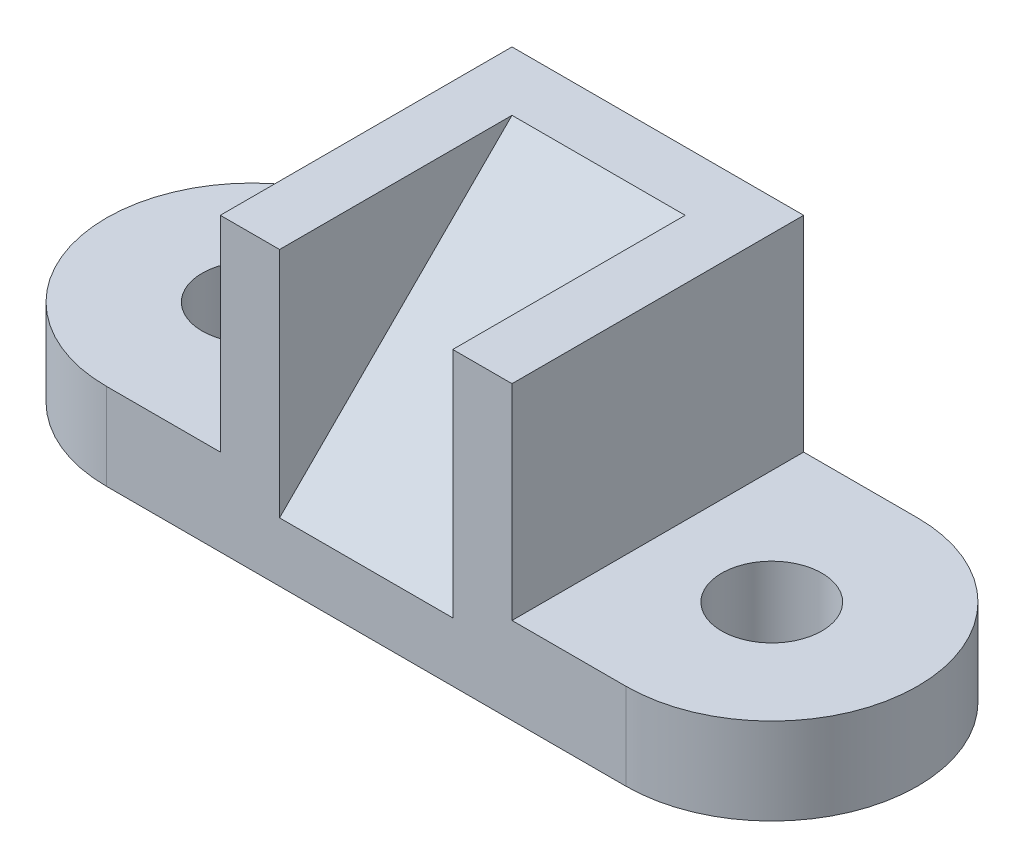
ISO-10303-21;
HEADER;
FILE_DESCRIPTION(('STEP AP214'),'2;1');
FILE_NAME('part.step','',(''),(''),'','','');
FILE_SCHEMA(('AUTOMOTIVE_DESIGN { 1 0 10303 214 1 1 1 1 }'));
ENDSEC;
DATA;
#1=APPLICATION_CONTEXT('core data for automotive mechanical design processes');
#2=APPLICATION_PROTOCOL_DEFINITION('international standard','automotive_design',2000,#1);
#3=PRODUCT_CONTEXT('',#1,'mechanical');
#4=PRODUCT('Part','Part','',(#3));
#5=PRODUCT_RELATED_PRODUCT_CATEGORY('part','',(#4));
#6=PRODUCT_DEFINITION_FORMATION('','',#4);
#7=PRODUCT_DEFINITION_CONTEXT('part definition',#1,'design');
#8=PRODUCT_DEFINITION('design','',#6,#7);
#9=PRODUCT_DEFINITION_SHAPE('','',#8);
#10=(LENGTH_UNIT() NAMED_UNIT(*) SI_UNIT(.MILLI.,.METRE.));
#11=(NAMED_UNIT(*) PLANE_ANGLE_UNIT() SI_UNIT($,.RADIAN.));
#12=(NAMED_UNIT(*) SI_UNIT($,.STERADIAN.) SOLID_ANGLE_UNIT());
#13=UNCERTAINTY_MEASURE_WITH_UNIT(LENGTH_MEASURE(1.E-05),#10,'distance_accuracy_value','');
#14=(GEOMETRIC_REPRESENTATION_CONTEXT(3) GLOBAL_UNCERTAINTY_ASSIGNED_CONTEXT((#13)) GLOBAL_UNIT_ASSIGNED_CONTEXT((#10,
#11,#12)) REPRESENTATION_CONTEXT('',''));
#15=CARTESIAN_POINT('',(0.,0.,0.));
#16=DIRECTION('',(0.,0.,1.));
#17=DIRECTION('',(1.,0.,0.));
#18=AXIS2_PLACEMENT_3D('',#15,#16,#17);
#19=CARTESIAN_POINT('',(0.,19.,0.));
#20=DIRECTION('',(0.,1.,0.));
#21=DIRECTION('',(0.,0.,1.));
#22=AXIS2_PLACEMENT_3D('',#19,#20,#21);
#23=PLANE('',#22);
#24=DIRECTION('',(0.,0.,1.));
#25=VECTOR('',#24,1.);
#26=CARTESIAN_POINT('',(25.,19.,-32.));
#27=LINE('',#26,#25);
#28=CARTESIAN_POINT('',(25.,19.,-32.));
#29=VERTEX_POINT('',#28);
#30=CARTESIAN_POINT('',(25.,19.,32.));
#31=VERTEX_POINT('',#30);
#32=EDGE_CURVE('E58',#29,#31,#27,.T.);
#33=ORIENTED_EDGE('',*,*,#32,.F.);
#34=DIRECTION('',(-1.,0.,0.));
#35=VECTOR('',#34,1.);
#36=CARTESIAN_POINT('',(0.,19.,-32.));
#37=LINE('',#36,#35);
#38=CARTESIAN_POINT('',(0.,19.,-32.));
#39=VERTEX_POINT('',#38);
#40=EDGE_CURVE('E234',#29,#39,#37,.T.);
#41=ORIENTED_EDGE('',*,*,#40,.T.);
#42=CARTESIAN_POINT('',(0.,19.,0.));
#43=DIRECTION('',(0.,1.,0.));
#44=DIRECTION('',(0.,0.,1.));
#45=AXIS2_PLACEMENT_3D('',#42,#43,#44);
#46=CIRCLE('',#45,32.);
#47=CARTESIAN_POINT('',(0.,19.,32.));
#48=VERTEX_POINT('',#47);
#49=EDGE_CURVE('E202',#39,#48,#46,.T.);
#50=ORIENTED_EDGE('',*,*,#49,.T.);
#51=DIRECTION('',(1.,0.,0.));
#52=VECTOR('',#51,1.);
#53=CARTESIAN_POINT('',(0.,19.,32.));
#54=LINE('',#53,#52);
#55=EDGE_CURVE('E215',#48,#31,#54,.T.);
#56=ORIENTED_EDGE('',*,*,#55,.T.);
#57=EDGE_LOOP('',(#33,#41,#50,#56));
#58=FACE_BOUND('',#57,.T.);
#59=CARTESIAN_POINT('',(0.,19.,0.));
#60=DIRECTION('',(0.,1.,0.));
#61=DIRECTION('',(0.,0.,1.));
#62=AXIS2_PLACEMENT_3D('',#59,#60,#61);
#63=CIRCLE('',#62,11.);
#64=CARTESIAN_POINT('',(0.,19.,11.));
#65=VERTEX_POINT('',#64);
#66=EDGE_CURVE('E196',#65,#65,#63,.T.);
#67=ORIENTED_EDGE('',*,*,#66,.F.);
#68=EDGE_LOOP('',(#67));
#69=FACE_BOUND('',#68,.T.);
#70=ADVANCED_FACE('F33',(#58,#69),#23,.T.);
#71=DIRECTION('',(0.,0.,-1.));
#72=VECTOR('',#71,1.);
#73=CARTESIAN_POINT('',(89.,19.,-32.));
#74=LINE('',#73,#72);
#75=CARTESIAN_POINT('',(89.,19.,32.));
#76=VERTEX_POINT('',#75);
#77=CARTESIAN_POINT('',(89.,19.,-32.));
#78=VERTEX_POINT('',#77);
#79=EDGE_CURVE('E148',#76,#78,#74,.T.);
#80=ORIENTED_EDGE('',*,*,#79,.F.);
#81=CARTESIAN_POINT('',(114.,19.,32.));
#82=VERTEX_POINT('',#81);
#83=EDGE_CURVE('E205',#76,#82,#54,.T.);
#84=ORIENTED_EDGE('',*,*,#83,.T.);
#85=CARTESIAN_POINT('',(114.,19.,0.));
#86=DIRECTION('',(0.,1.,0.));
#87=DIRECTION('',(0.,0.,1.));
#88=AXIS2_PLACEMENT_3D('',#85,#86,#87);
#89=CIRCLE('',#88,32.);
#90=CARTESIAN_POINT('',(114.,19.,-32.));
#91=VERTEX_POINT('',#90);
#92=EDGE_CURVE('E209',#82,#91,#89,.T.);
#93=ORIENTED_EDGE('',*,*,#92,.T.);
#94=EDGE_CURVE('E225',#91,#78,#37,.T.);
#95=ORIENTED_EDGE('',*,*,#94,.T.);
#96=EDGE_LOOP('',(#80,#84,#93,#95));
#97=FACE_BOUND('',#96,.T.);
#98=CARTESIAN_POINT('',(114.,19.,0.));
#99=DIRECTION('',(0.,1.,0.));
#100=DIRECTION('',(0.,0.,1.));
#101=AXIS2_PLACEMENT_3D('',#98,#99,#100);
#102=CIRCLE('',#101,11.);
#103=CARTESIAN_POINT('',(114.,19.,11.));
#104=VERTEX_POINT('',#103);
#105=EDGE_CURVE('E189',#104,#104,#102,.T.);
#106=ORIENTED_EDGE('',*,*,#105,.F.);
#107=EDGE_LOOP('',(#106));
#108=FACE_BOUND('',#107,.T.);
#109=ADVANCED_FACE('F240',(#97,#108),#23,.T.);
#110=CARTESIAN_POINT('',(0.,0.,0.));
#111=DIRECTION('',(0.,1.,0.));
#112=DIRECTION('',(0.,0.,1.));
#113=AXIS2_PLACEMENT_3D('',#110,#111,#112);
#114=PLANE('',#113);
#115=CARTESIAN_POINT('',(0.,0.,0.));
#116=DIRECTION('',(0.,1.,0.));
#117=DIRECTION('',(0.,0.,1.));
#118=AXIS2_PLACEMENT_3D('',#115,#116,#117);
#119=CIRCLE('',#118,11.);
#120=CARTESIAN_POINT('',(0.,0.,11.));
#121=VERTEX_POINT('',#120);
#122=EDGE_CURVE('E194',#121,#121,#119,.T.);
#123=ORIENTED_EDGE('',*,*,#122,.T.);
#124=EDGE_LOOP('',(#123));
#125=FACE_BOUND('',#124,.T.);
#126=CARTESIAN_POINT('',(0.,0.,0.));
#127=DIRECTION('',(0.,1.,0.));
#128=DIRECTION('',(0.,0.,1.));
#129=AXIS2_PLACEMENT_3D('',#126,#127,#128);
#130=CIRCLE('',#129,32.);
#131=CARTESIAN_POINT('',(0.,0.,-32.));
#132=VERTEX_POINT('',#131);
#133=CARTESIAN_POINT('',(0.,0.,32.));
#134=VERTEX_POINT('',#133);
#135=EDGE_CURVE('E199',#132,#134,#130,.T.);
#136=ORIENTED_EDGE('',*,*,#135,.F.);
#137=DIRECTION('',(-1.,0.,0.));
#138=VECTOR('',#137,1.);
#139=CARTESIAN_POINT('',(0.,0.,-32.));
#140=LINE('',#139,#138);
#141=CARTESIAN_POINT('',(114.,0.,-32.));
#142=VERTEX_POINT('',#141);
#143=EDGE_CURVE('E206',#142,#132,#140,.T.);
#144=ORIENTED_EDGE('',*,*,#143,.F.);
#145=CARTESIAN_POINT('',(114.,0.,0.));
#146=DIRECTION('',(0.,1.,0.));
#147=DIRECTION('',(0.,0.,1.));
#148=AXIS2_PLACEMENT_3D('',#145,#146,#147);
#149=CIRCLE('',#148,32.);
#150=CARTESIAN_POINT('',(114.,0.,32.));
#151=VERTEX_POINT('',#150);
#152=EDGE_CURVE('E227',#151,#142,#149,.T.);
#153=ORIENTED_EDGE('',*,*,#152,.F.);
#154=DIRECTION('',(1.,0.,0.));
#155=VECTOR('',#154,1.);
#156=CARTESIAN_POINT('',(0.,0.,32.));
#157=LINE('',#156,#155);
#158=EDGE_CURVE('E229',#134,#151,#157,.T.);
#159=ORIENTED_EDGE('',*,*,#158,.F.);
#160=EDGE_LOOP('',(#136,#144,#153,#159));
#161=FACE_BOUND('',#160,.T.);
#162=CARTESIAN_POINT('',(114.,0.,0.));
#163=DIRECTION('',(0.,1.,0.));
#164=DIRECTION('',(0.,0.,1.));
#165=AXIS2_PLACEMENT_3D('',#162,#163,#164);
#166=CIRCLE('',#165,11.);
#167=CARTESIAN_POINT('',(114.,0.,11.));
#168=VERTEX_POINT('',#167);
#169=EDGE_CURVE('E186',#168,#168,#166,.T.);
#170=ORIENTED_EDGE('',*,*,#169,.T.);
#171=EDGE_LOOP('',(#170));
#172=FACE_BOUND('',#171,.T.);
#173=ADVANCED_FACE('F266',(#125,#161,#172),#114,.F.);
#174=CARTESIAN_POINT('',(0.,19.,0.));
#175=DIRECTION('',(0.,-1.,0.));
#176=DIRECTION('',(0.,0.,-1.));
#177=AXIS2_PLACEMENT_3D('',#174,#175,#176);
#178=CYLINDRICAL_SURFACE('',#177,32.);
#179=ORIENTED_EDGE('',*,*,#135,.T.);
#180=DIRECTION('',(0.,-1.,0.));
#181=VECTOR('',#180,1.);
#182=CARTESIAN_POINT('',(0.,19.,32.));
#183=LINE('',#182,#181);
#184=EDGE_CURVE('E11',#48,#134,#183,.T.);
#185=ORIENTED_EDGE('',*,*,#184,.F.);
#186=ORIENTED_EDGE('',*,*,#49,.F.);
#187=DIRECTION('',(0.,-1.,0.));
#188=VECTOR('',#187,1.);
#189=CARTESIAN_POINT('',(0.,19.,-32.));
#190=LINE('',#189,#188);
#191=EDGE_CURVE('E222',#39,#132,#190,.T.);
#192=ORIENTED_EDGE('',*,*,#191,.T.);
#193=EDGE_LOOP('',(#179,#185,#186,#192));
#194=FACE_BOUND('',#193,.T.);
#195=ADVANCED_FACE('F35',(#194),#178,.T.);
#196=CARTESIAN_POINT('',(0.,19.,32.));
#197=DIRECTION('',(0.,0.,-1.));
#198=DIRECTION('',(-1.,0.,0.));
#199=AXIS2_PLACEMENT_3D('',#196,#197,#198);
#200=PLANE('',#199);
#201=DIRECTION('',(1.,0.,0.));
#202=VECTOR('',#201,1.);
#203=CARTESIAN_POINT('',(38.,13.,32.));
#204=LINE('',#203,#202);
#205=CARTESIAN_POINT('',(38.,13.,32.));
#206=VERTEX_POINT('',#205);
#207=CARTESIAN_POINT('',(76.,13.,32.));
#208=VERTEX_POINT('',#207);
#209=EDGE_CURVE('E123',#206,#208,#204,.T.);
#210=ORIENTED_EDGE('',*,*,#209,.F.);
#211=DIRECTION('',(0.,-1.,0.));
#212=VECTOR('',#211,1.);
#213=CARTESIAN_POINT('',(38.,13.,32.));
#214=LINE('',#213,#212);
#215=CARTESIAN_POINT('',(38.,64.,32.));
#216=VERTEX_POINT('',#215);
#217=EDGE_CURVE('E129',#216,#206,#214,.T.);
#218=ORIENTED_EDGE('',*,*,#217,.F.);
#219=DIRECTION('',(1.,0.,0.));
#220=VECTOR('',#219,1.);
#221=CARTESIAN_POINT('',(25.,64.,32.));
#222=LINE('',#221,#220);
#223=CARTESIAN_POINT('',(25.,64.,32.));
#224=VERTEX_POINT('',#223);
#225=EDGE_CURVE('E149',#224,#216,#222,.T.);
#226=ORIENTED_EDGE('',*,*,#225,.F.);
#227=DIRECTION('',(0.,-1.,0.));
#228=VECTOR('',#227,1.);
#229=CARTESIAN_POINT('',(25.,64.,32.));
#230=LINE('',#229,#228);
#231=EDGE_CURVE('E177',#224,#31,#230,.T.);
#232=ORIENTED_EDGE('',*,*,#231,.T.);
#233=ORIENTED_EDGE('',*,*,#55,.F.);
#234=ORIENTED_EDGE('',*,*,#184,.T.);
#235=ORIENTED_EDGE('',*,*,#158,.T.);
#236=DIRECTION('',(0.,-1.,0.));
#237=VECTOR('',#236,1.);
#238=CARTESIAN_POINT('',(114.,19.,32.));
#239=LINE('',#238,#237);
#240=EDGE_CURVE('E42',#82,#151,#239,.T.);
#241=ORIENTED_EDGE('',*,*,#240,.F.);
#242=ORIENTED_EDGE('',*,*,#83,.F.);
#243=DIRECTION('',(0.,-1.,0.));
#244=VECTOR('',#243,1.);
#245=CARTESIAN_POINT('',(89.,64.,32.));
#246=LINE('',#245,#244);
#247=CARTESIAN_POINT('',(89.,64.,32.));
#248=VERTEX_POINT('',#247);
#249=EDGE_CURVE('E170',#248,#76,#246,.T.);
#250=ORIENTED_EDGE('',*,*,#249,.F.);
#251=CARTESIAN_POINT('',(76.,64.,32.));
#252=VERTEX_POINT('',#251);
#253=EDGE_CURVE('E147',#252,#248,#222,.T.);
#254=ORIENTED_EDGE('',*,*,#253,.F.);
#255=DIRECTION('',(0.,-1.,0.));
#256=VECTOR('',#255,1.);
#257=CARTESIAN_POINT('',(76.,13.,32.));
#258=LINE('',#257,#256);
#259=EDGE_CURVE('E50',#252,#208,#258,.T.);
#260=ORIENTED_EDGE('',*,*,#259,.T.);
#261=EDGE_LOOP('',(#210,#218,#226,#232,#233,#234,#235,#241,#242,#250,#254,#260));
#262=FACE_BOUND('',#261,.T.);
#263=ADVANCED_FACE('F137',(#262),#200,.F.);
#264=CARTESIAN_POINT('',(114.,19.,0.));
#265=DIRECTION('',(0.,-1.,0.));
#266=DIRECTION('',(0.,0.,-1.));
#267=AXIS2_PLACEMENT_3D('',#264,#265,#266);
#268=CYLINDRICAL_SURFACE('',#267,32.);
#269=ORIENTED_EDGE('',*,*,#152,.T.);
#270=DIRECTION('',(0.,-1.,0.));
#271=VECTOR('',#270,1.);
#272=CARTESIAN_POINT('',(114.,19.,-32.));
#273=LINE('',#272,#271);
#274=EDGE_CURVE('E219',#91,#142,#273,.T.);
#275=ORIENTED_EDGE('',*,*,#274,.F.);
#276=ORIENTED_EDGE('',*,*,#92,.F.);
#277=ORIENTED_EDGE('',*,*,#240,.T.);
#278=EDGE_LOOP('',(#269,#275,#276,#277));
#279=FACE_BOUND('',#278,.T.);
#280=ADVANCED_FACE('F245',(#279),#268,.T.);
#281=CARTESIAN_POINT('',(0.,19.,-32.));
#282=DIRECTION('',(0.,0.,1.));
#283=DIRECTION('',(1.,0.,0.));
#284=AXIS2_PLACEMENT_3D('',#281,#282,#283);
#285=PLANE('',#284);
#286=ORIENTED_EDGE('',*,*,#143,.T.);
#287=ORIENTED_EDGE('',*,*,#191,.F.);
#288=ORIENTED_EDGE('',*,*,#40,.F.);
#289=DIRECTION('',(0.,-1.,0.));
#290=VECTOR('',#289,1.);
#291=CARTESIAN_POINT('',(25.,64.,-32.));
#292=LINE('',#291,#290);
#293=CARTESIAN_POINT('',(25.,64.,-32.));
#294=VERTEX_POINT('',#293);
#295=EDGE_CURVE('E155',#294,#29,#292,.T.);
#296=ORIENTED_EDGE('',*,*,#295,.F.);
#297=DIRECTION('',(-1.,0.,0.));
#298=VECTOR('',#297,1.);
#299=CARTESIAN_POINT('',(25.,64.,-32.));
#300=LINE('',#299,#298);
#301=CARTESIAN_POINT('',(89.,64.,-32.));
#302=VERTEX_POINT('',#301);
#303=EDGE_CURVE('E153',#302,#294,#300,.T.);
#304=ORIENTED_EDGE('',*,*,#303,.F.);
#305=DIRECTION('',(0.,-1.,0.));
#306=VECTOR('',#305,1.);
#307=CARTESIAN_POINT('',(89.,64.,-32.));
#308=LINE('',#307,#306);
#309=EDGE_CURVE('E165',#302,#78,#308,.T.);
#310=ORIENTED_EDGE('',*,*,#309,.T.);
#311=ORIENTED_EDGE('',*,*,#94,.F.);
#312=ORIENTED_EDGE('',*,*,#274,.T.);
#313=EDGE_LOOP('',(#286,#287,#288,#296,#304,#310,#311,#312));
#314=FACE_BOUND('',#313,.T.);
#315=ADVANCED_FACE('F248',(#314),#285,.F.);
#316=CARTESIAN_POINT('',(0.,19.,0.));
#317=DIRECTION('',(0.,-1.,0.));
#318=DIRECTION('',(0.,0.,-1.));
#319=AXIS2_PLACEMENT_3D('',#316,#317,#318);
#320=CYLINDRICAL_SURFACE('',#319,11.);
#321=ORIENTED_EDGE('',*,*,#66,.T.);
#322=EDGE_LOOP('',(#321));
#323=FACE_BOUND('',#322,.T.);
#324=ORIENTED_EDGE('',*,*,#122,.F.);
#325=EDGE_LOOP('',(#324));
#326=FACE_BOUND('',#325,.T.);
#327=ADVANCED_FACE('F250',(#323,#326),#320,.F.);
#328=CARTESIAN_POINT('',(114.,19.,0.));
#329=DIRECTION('',(0.,-1.,0.));
#330=DIRECTION('',(0.,0.,-1.));
#331=AXIS2_PLACEMENT_3D('',#328,#329,#330);
#332=CYLINDRICAL_SURFACE('',#331,11.);
#333=ORIENTED_EDGE('',*,*,#105,.T.);
#334=EDGE_LOOP('',(#333));
#335=FACE_BOUND('',#334,.T.);
#336=ORIENTED_EDGE('',*,*,#169,.F.);
#337=EDGE_LOOP('',(#336));
#338=FACE_BOUND('',#337,.T.);
#339=ADVANCED_FACE('F256',(#335,#338),#332,.F.);
#340=CARTESIAN_POINT('',(25.,64.,-32.));
#341=DIRECTION('',(1.,0.,0.));
#342=DIRECTION('',(0.,0.,-1.));
#343=AXIS2_PLACEMENT_3D('',#340,#341,#342);
#344=PLANE('',#343);
#345=ORIENTED_EDGE('',*,*,#32,.T.);
#346=ORIENTED_EDGE('',*,*,#231,.F.);
#347=DIRECTION('',(0.,0.,1.));
#348=VECTOR('',#347,1.);
#349=CARTESIAN_POINT('',(25.,64.,-32.));
#350=LINE('',#349,#348);
#351=EDGE_CURVE('E144',#294,#224,#350,.T.);
#352=ORIENTED_EDGE('',*,*,#351,.F.);
#353=ORIENTED_EDGE('',*,*,#295,.T.);
#354=EDGE_LOOP('',(#345,#346,#352,#353));
#355=FACE_BOUND('',#354,.T.);
#356=ADVANCED_FACE('F280',(#355),#344,.F.);
#357=CARTESIAN_POINT('',(89.,64.,-32.));
#358=DIRECTION('',(-1.,0.,0.));
#359=DIRECTION('',(0.,0.,1.));
#360=AXIS2_PLACEMENT_3D('',#357,#358,#359);
#361=PLANE('',#360);
#362=ORIENTED_EDGE('',*,*,#79,.T.);
#363=ORIENTED_EDGE('',*,*,#309,.F.);
#364=DIRECTION('',(0.,0.,-1.));
#365=VECTOR('',#364,1.);
#366=CARTESIAN_POINT('',(89.,64.,-32.));
#367=LINE('',#366,#365);
#368=EDGE_CURVE('E151',#248,#302,#367,.T.);
#369=ORIENTED_EDGE('',*,*,#368,.F.);
#370=ORIENTED_EDGE('',*,*,#249,.T.);
#371=EDGE_LOOP('',(#362,#363,#369,#370));
#372=FACE_BOUND('',#371,.T.);
#373=ADVANCED_FACE('F286',(#372),#361,.F.);
#374=CARTESIAN_POINT('',(0.,64.,0.));
#375=DIRECTION('',(0.,1.,0.));
#376=DIRECTION('',(0.,0.,1.));
#377=AXIS2_PLACEMENT_3D('',#374,#375,#376);
#378=PLANE('',#377);
#379=DIRECTION('',(0.,0.,1.));
#380=VECTOR('',#379,1.);
#381=CARTESIAN_POINT('',(38.,64.,32.));
#382=LINE('',#381,#380);
#383=CARTESIAN_POINT('',(38.,64.,-19.));
#384=VERTEX_POINT('',#383);
#385=EDGE_CURVE('E128',#384,#216,#382,.T.);
#386=ORIENTED_EDGE('',*,*,#385,.F.);
#387=DIRECTION('',(1.,0.,0.));
#388=VECTOR('',#387,1.);
#389=CARTESIAN_POINT('',(38.,64.,-19.));
#390=LINE('',#389,#388);
#391=CARTESIAN_POINT('',(76.,64.,-19.));
#392=VERTEX_POINT('',#391);
#393=EDGE_CURVE('E125',#384,#392,#390,.T.);
#394=ORIENTED_EDGE('',*,*,#393,.T.);
#395=DIRECTION('',(0.,0.,1.));
#396=VECTOR('',#395,1.);
#397=CARTESIAN_POINT('',(76.,64.,32.));
#398=LINE('',#397,#396);
#399=EDGE_CURVE('E135',#392,#252,#398,.T.);
#400=ORIENTED_EDGE('',*,*,#399,.T.);
#401=ORIENTED_EDGE('',*,*,#253,.T.);
#402=ORIENTED_EDGE('',*,*,#368,.T.);
#403=ORIENTED_EDGE('',*,*,#303,.T.);
#404=ORIENTED_EDGE('',*,*,#351,.T.);
#405=ORIENTED_EDGE('',*,*,#225,.T.);
#406=EDGE_LOOP('',(#386,#394,#400,#401,#402,#403,#404,#405));
#407=FACE_BOUND('',#406,.T.);
#408=ADVANCED_FACE('F282',(#407),#378,.T.);
#409=CARTESIAN_POINT('',(38.,64.,-19.));
#410=DIRECTION('',(0.,-0.707106781186548,-0.707106781186548));
#411=DIRECTION('',(0.,0.707106781186548,-0.707106781186548));
#412=AXIS2_PLACEMENT_3D('',#409,#410,#411);
#413=PLANE('',#412);
#414=DIRECTION('',(0.,0.707106781186547,-0.707106781186547));
#415=VECTOR('',#414,1.);
#416=CARTESIAN_POINT('',(76.,64.,-19.));
#417=LINE('',#416,#415);
#418=EDGE_CURVE('E395',#208,#392,#417,.T.);
#419=ORIENTED_EDGE('',*,*,#418,.T.);
#420=ORIENTED_EDGE('',*,*,#393,.F.);
#421=DIRECTION('',(0.,0.707106781186547,-0.707106781186547));
#422=VECTOR('',#421,1.);
#423=CARTESIAN_POINT('',(38.,64.,-19.));
#424=LINE('',#423,#422);
#425=EDGE_CURVE('E119',#206,#384,#424,.T.);
#426=ORIENTED_EDGE('',*,*,#425,.F.);
#427=ORIENTED_EDGE('',*,*,#209,.T.);
#428=EDGE_LOOP('',(#419,#420,#426,#427));
#429=FACE_BOUND('',#428,.T.);
#430=ADVANCED_FACE('F121',(#429),#413,.F.);
#431=CARTESIAN_POINT('',(38.,0.,0.));
#432=DIRECTION('',(-1.,0.,0.));
#433=DIRECTION('',(0.,0.,1.));
#434=AXIS2_PLACEMENT_3D('',#431,#432,#433);
#435=PLANE('',#434);
#436=ORIENTED_EDGE('',*,*,#217,.T.);
#437=ORIENTED_EDGE('',*,*,#425,.T.);
#438=ORIENTED_EDGE('',*,*,#385,.T.);
#439=EDGE_LOOP('',(#436,#437,#438));
#440=FACE_BOUND('',#439,.T.);
#441=ADVANCED_FACE('F132',(#440),#435,.F.);
#442=CARTESIAN_POINT('',(76.,0.,0.));
#443=DIRECTION('',(-1.,0.,0.));
#444=DIRECTION('',(0.,0.,1.));
#445=AXIS2_PLACEMENT_3D('',#442,#443,#444);
#446=PLANE('',#445);
#447=ORIENTED_EDGE('',*,*,#259,.F.);
#448=ORIENTED_EDGE('',*,*,#399,.F.);
#449=ORIENTED_EDGE('',*,*,#418,.F.);
#450=EDGE_LOOP('',(#447,#448,#449));
#451=FACE_BOUND('',#450,.T.);
#452=ADVANCED_FACE('F346',(#451),#446,.T.);
#453=CLOSED_SHELL('',(#70,#109,#173,#195,#263,#280,#315,#327,#339,#356,#373,#408,#430,#441,#452));
#454=MANIFOLD_SOLID_BREP('B2',#453);
#455=ADVANCED_BREP_SHAPE_REPRESENTATION('',(#18,#454),#14);
#456=SHAPE_DEFINITION_REPRESENTATION(#9,#455);
ENDSEC;
END-ISO-10303-21;
